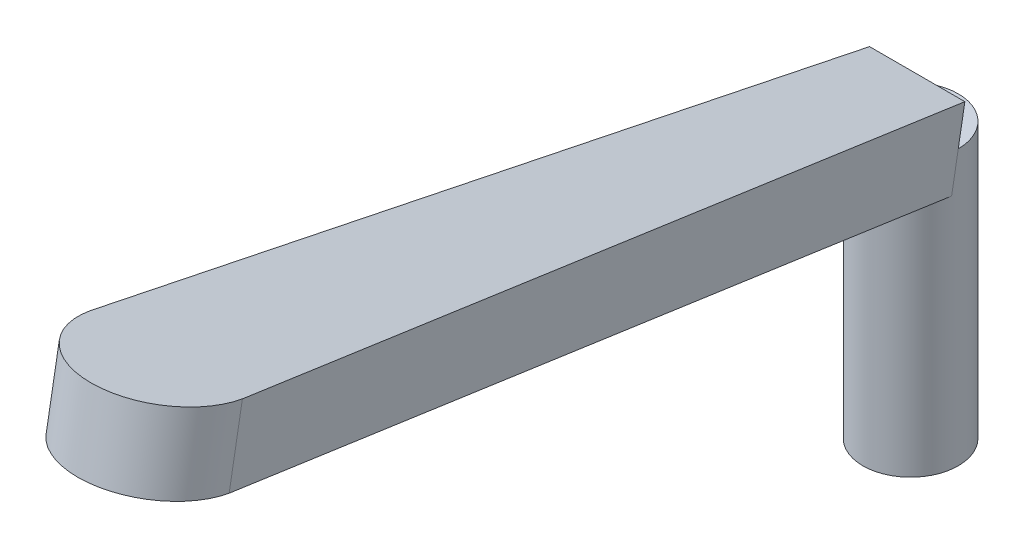
ISO-10303-21;
HEADER;
FILE_DESCRIPTION(('STEP AP214'),'2;1');
FILE_NAME('part.step','',(''),(''),'','','');
FILE_SCHEMA(('AUTOMOTIVE_DESIGN { 1 0 10303 214 1 1 1 1 }'));
ENDSEC;
DATA;
#1=APPLICATION_CONTEXT('core data for automotive mechanical design processes');
#2=APPLICATION_PROTOCOL_DEFINITION('international standard','automotive_design',2000,#1);
#3=PRODUCT_CONTEXT('',#1,'mechanical');
#4=PRODUCT('Part','Part','',(#3));
#5=PRODUCT_RELATED_PRODUCT_CATEGORY('part','',(#4));
#6=PRODUCT_DEFINITION_FORMATION('','',#4);
#7=PRODUCT_DEFINITION_CONTEXT('part definition',#1,'design');
#8=PRODUCT_DEFINITION('design','',#6,#7);
#9=PRODUCT_DEFINITION_SHAPE('','',#8);
#10=(LENGTH_UNIT() NAMED_UNIT(*) SI_UNIT(.MILLI.,.METRE.));
#11=(NAMED_UNIT(*) PLANE_ANGLE_UNIT() SI_UNIT($,.RADIAN.));
#12=(NAMED_UNIT(*) SI_UNIT($,.STERADIAN.) SOLID_ANGLE_UNIT());
#13=UNCERTAINTY_MEASURE_WITH_UNIT(LENGTH_MEASURE(1.E-05),#10,'distance_accuracy_value','');
#14=(GEOMETRIC_REPRESENTATION_CONTEXT(3) GLOBAL_UNCERTAINTY_ASSIGNED_CONTEXT((#13)) GLOBAL_UNIT_ASSIGNED_CONTEXT((#10,
#11,#12)) REPRESENTATION_CONTEXT('',''));
#15=CARTESIAN_POINT('',(0.,0.,0.));
#16=DIRECTION('',(0.,0.,1.));
#17=DIRECTION('',(1.,0.,0.));
#18=AXIS2_PLACEMENT_3D('',#15,#16,#17);
#19=CARTESIAN_POINT('',(0.,45.72,0.));
#20=DIRECTION('',(0.,-1.,0.));
#21=DIRECTION('',(0.,0.,-1.));
#22=AXIS2_PLACEMENT_3D('',#19,#20,#21);
#23=CYLINDRICAL_SURFACE('',#22,7.9375);
#24=CARTESIAN_POINT('',(0.,0.,0.));
#25=DIRECTION('',(0.,1.,0.));
#26=DIRECTION('',(0.,0.,1.));
#27=AXIS2_PLACEMENT_3D('',#24,#25,#26);
#28=CIRCLE('',#27,7.9375);
#29=CARTESIAN_POINT('',(0.,0.,7.9375));
#30=VERTEX_POINT('',#29);
#31=EDGE_CURVE('E122',#30,#30,#28,.T.);
#32=ORIENTED_EDGE('',*,*,#31,.T.);
#33=EDGE_LOOP('',(#32));
#34=FACE_BOUND('',#33,.T.);
#35=CARTESIAN_POINT('',(0.,45.72,0.));
#36=DIRECTION('',(0.,0.173648177666927,0.984807753012209));
#37=DIRECTION('',(0.,-0.984807753012209,0.173648177666927));
#38=AXIS2_PLACEMENT_3D('',#35,#36,#37);
#39=ELLIPSE('',#38,45.7102407099534,7.9375);
#40=CARTESIAN_POINT('',(7.86053650209831,39.4664707683725,1.10266592818499));
#41=VERTEX_POINT('',#40);
#42=CARTESIAN_POINT('',(7.9375,45.72,0.));
#43=VERTEX_POINT('',#42);
#44=EDGE_CURVE('E114',#41,#43,#39,.T.);
#45=ORIENTED_EDGE('',*,*,#44,.F.);
#46=CARTESIAN_POINT('',(0.,39.2720410145255,0.));
#47=DIRECTION('',(0.,0.984807753012209,-0.173648177666927));
#48=DIRECTION('',(0.,-0.173648177666927,-0.984807753012209));
#49=AXIS2_PLACEMENT_3D('',#46,#47,#48);
#50=ELLIPSE('',#49,8.0599487318431,7.9375);
#51=CARTESIAN_POINT('',(-7.86053650209831,39.4664707683725,1.10266592818499));
#52=VERTEX_POINT('',#51);
#53=EDGE_CURVE('E11',#52,#41,#50,.T.);
#54=ORIENTED_EDGE('',*,*,#53,.F.);
#55=CARTESIAN_POINT('',(-7.9375,45.72,0.));
#56=VERTEX_POINT('',#55);
#57=EDGE_CURVE('E94',#56,#52,#39,.T.);
#58=ORIENTED_EDGE('',*,*,#57,.F.);
#59=CARTESIAN_POINT('',(0.,45.72,0.));
#60=DIRECTION('',(0.,1.,0.));
#61=DIRECTION('',(0.,0.,1.));
#62=AXIS2_PLACEMENT_3D('',#59,#60,#61);
#63=CIRCLE('',#62,7.9375);
#64=EDGE_CURVE('E119',#43,#56,#63,.T.);
#65=ORIENTED_EDGE('',*,*,#64,.F.);
#66=EDGE_LOOP('',(#45,#54,#58,#65));
#67=FACE_BOUND('',#66,.T.);
#68=ADVANCED_FACE('F37',(#34,#67),#23,.T.);
#69=CARTESIAN_POINT('',(0.,45.72,0.));
#70=DIRECTION('',(0.,1.,0.));
#71=DIRECTION('',(0.,0.,1.));
#72=AXIS2_PLACEMENT_3D('',#69,#70,#71);
#73=PLANE('',#72);
#74=ORIENTED_EDGE('',*,*,#64,.T.);
#75=DIRECTION('',(1.,0.,0.));
#76=VECTOR('',#75,1.);
#77=CARTESIAN_POINT('',(0.,45.72,0.));
#78=LINE('',#77,#76);
#79=EDGE_CURVE('E44',#56,#43,#78,.T.);
#80=ORIENTED_EDGE('',*,*,#79,.T.);
#81=EDGE_LOOP('',(#74,#80));
#82=FACE_BOUND('',#81,.T.);
#83=ADVANCED_FACE('F126',(#82),#73,.T.);
#84=CARTESIAN_POINT('',(0.,0.,0.));
#85=DIRECTION('',(0.,1.,0.));
#86=DIRECTION('',(0.,0.,1.));
#87=AXIS2_PLACEMENT_3D('',#84,#85,#86);
#88=PLANE('',#87);
#89=ORIENTED_EDGE('',*,*,#31,.F.);
#90=EDGE_LOOP('',(#89));
#91=FACE_BOUND('',#90,.T.);
#92=ADVANCED_FACE('F173',(#91),#88,.F.);
#93=CARTESIAN_POINT('',(-7.9375,39.4664707683725,1.10266592818499));
#94=DIRECTION('',(0.,0.173648177666927,0.984807753012209));
#95=DIRECTION('',(0.,-0.984807753012209,0.173648177666927));
#96=AXIS2_PLACEMENT_3D('',#93,#94,#95);
#97=PLANE('',#96);
#98=DIRECTION('',(1.,0.,0.));
#99=VECTOR('',#98,1.);
#100=CARTESIAN_POINT('',(-7.9375,39.4664707683725,1.10266592818499));
#101=LINE('',#100,#99);
#102=CARTESIAN_POINT('',(7.9375,39.4664707683725,1.10266592818499));
#103=VERTEX_POINT('',#102);
#104=EDGE_CURVE('E98',#41,#103,#101,.T.);
#105=ORIENTED_EDGE('',*,*,#104,.F.);
#106=ORIENTED_EDGE('',*,*,#44,.T.);
#107=DIRECTION('',(0.,0.984807753012209,-0.173648177666927));
#108=VECTOR('',#107,1.);
#109=CARTESIAN_POINT('',(7.9375,39.4664707683725,1.10266592818499));
#110=LINE('',#109,#108);
#111=EDGE_CURVE('E51',#103,#43,#110,.T.);
#112=ORIENTED_EDGE('',*,*,#111,.F.);
#113=EDGE_LOOP('',(#105,#106,#112));
#114=FACE_BOUND('',#113,.T.);
#115=ADVANCED_FACE('F132',(#114),#97,.F.);
#116=DIRECTION('',(0.,0.984807753012209,-0.173648177666927));
#117=VECTOR('',#116,1.);
#118=CARTESIAN_POINT('',(-7.9375,39.4664707683725,1.10266592818499));
#119=LINE('',#118,#117);
#120=CARTESIAN_POINT('',(-7.9375,39.4664707683725,1.10266592818499));
#121=VERTEX_POINT('',#120);
#122=EDGE_CURVE('E92',#121,#56,#119,.T.);
#123=ORIENTED_EDGE('',*,*,#122,.T.);
#124=ORIENTED_EDGE('',*,*,#57,.T.);
#125=EDGE_CURVE('E88',#121,#52,#101,.T.);
#126=ORIENTED_EDGE('',*,*,#125,.F.);
#127=EDGE_LOOP('',(#123,#124,#126));
#128=FACE_BOUND('',#127,.T.);
#129=ADVANCED_FACE('F90',(#128),#97,.F.);
#130=CARTESIAN_POINT('',(-12.6999999999999,61.5197893320722,126.173250560735));
#131=DIRECTION('',(0.999297615709181,0.00650723287180506,0.0369043514818875));
#132=DIRECTION('',(0.0369051328471014,0.,-0.999318773550031));
#133=AXIS2_PLACEMENT_3D('',#130,#131,#132);
#134=PLANE('',#133);
#135=DIRECTION('',(0.0374736605890936,-0.173526209914805,-0.984116039517016));
#136=VECTOR('',#135,1.);
#137=CARTESIAN_POINT('',(-12.6999999999999,74.0268477953273,123.967918704366));
#138=LINE('',#137,#136);
#139=CARTESIAN_POINT('',(-12.6999999999999,74.0268477953273,123.967918704366));
#140=VERTEX_POINT('',#139);
#141=CARTESIAN_POINT('',(-7.9375,51.9735292316275,-1.10266592818499));
#142=VERTEX_POINT('',#141);
#143=EDGE_CURVE('E137',#140,#142,#138,.T.);
#144=ORIENTED_EDGE('',*,*,#143,.T.);
#145=EDGE_CURVE('E112',#56,#142,#119,.T.);
#146=ORIENTED_EDGE('',*,*,#145,.F.);
#147=ORIENTED_EDGE('',*,*,#122,.F.);
#148=DIRECTION('',(0.0374736605890936,-0.173526209914805,-0.984116039517016));
#149=VECTOR('',#148,1.);
#150=CARTESIAN_POINT('',(-12.6999999999999,61.5197893320722,126.173250560735));
#151=LINE('',#150,#149);
#152=CARTESIAN_POINT('',(-12.6999999999999,61.5197893320722,126.173250560735));
#153=VERTEX_POINT('',#152);
#154=EDGE_CURVE('E101',#153,#121,#151,.T.);
#155=ORIENTED_EDGE('',*,*,#154,.F.);
#156=DIRECTION('',(0.,0.984807753012209,-0.173648177666927));
#157=VECTOR('',#156,1.);
#158=CARTESIAN_POINT('',(-12.6999999999999,61.5197893320722,126.173250560735));
#159=LINE('',#158,#157);
#160=EDGE_CURVE('E136',#153,#140,#159,.T.);
#161=ORIENTED_EDGE('',*,*,#160,.T.);
#162=EDGE_LOOP('',(#144,#146,#147,#155,#161));
#163=FACE_BOUND('',#162,.T.);
#164=ADVANCED_FACE('F111',(#163),#134,.F.);
#165=ORIENTED_EDGE('',*,*,#79,.F.);
#166=ORIENTED_EDGE('',*,*,#145,.T.);
#167=DIRECTION('',(1.,0.,0.));
#168=VECTOR('',#167,1.);
#169=CARTESIAN_POINT('',(-7.9375,51.9735292316275,-1.10266592818499));
#170=LINE('',#169,#168);
#171=CARTESIAN_POINT('',(7.9375,51.9735292316275,-1.10266592818499));
#172=VERTEX_POINT('',#171);
#173=EDGE_CURVE('E139',#142,#172,#170,.T.);
#174=ORIENTED_EDGE('',*,*,#173,.T.);
#175=EDGE_CURVE('E147',#43,#172,#110,.T.);
#176=ORIENTED_EDGE('',*,*,#175,.F.);
#177=EDGE_LOOP('',(#165,#166,#174,#176));
#178=FACE_BOUND('',#177,.T.);
#179=ADVANCED_FACE('F154',(#178),#97,.F.);
#180=CARTESIAN_POINT('',(7.9375,39.4664707683725,1.10266592818499));
#181=DIRECTION('',(-0.999297615709181,0.00650723287180529,0.0369043514818887));
#182=DIRECTION('',(0.0369051328471027,0.,0.999318773550031));
#183=AXIS2_PLACEMENT_3D('',#180,#181,#182);
#184=PLANE('',#183);
#185=DIRECTION('',(0.0374736605890949,0.173526209914805,0.984116039517016));
#186=VECTOR('',#185,1.);
#187=CARTESIAN_POINT('',(7.9375,51.9735292316275,-1.10266592818499));
#188=LINE('',#187,#186);
#189=CARTESIAN_POINT('',(12.7000000000001,74.0268477953273,123.967918704366));
#190=VERTEX_POINT('',#189);
#191=EDGE_CURVE('E142',#172,#190,#188,.T.);
#192=ORIENTED_EDGE('',*,*,#191,.T.);
#193=DIRECTION('',(0.,0.984807753012209,-0.173648177666927));
#194=VECTOR('',#193,1.);
#195=CARTESIAN_POINT('',(12.7000000000001,61.5197893320722,126.173250560735));
#196=LINE('',#195,#194);
#197=CARTESIAN_POINT('',(12.7000000000001,61.5197893320722,126.173250560735));
#198=VERTEX_POINT('',#197);
#199=EDGE_CURVE('E145',#198,#190,#196,.T.);
#200=ORIENTED_EDGE('',*,*,#199,.F.);
#201=DIRECTION('',(0.0374736605890949,0.173526209914805,0.984116039517016));
#202=VECTOR('',#201,1.);
#203=CARTESIAN_POINT('',(7.9375,39.4664707683725,1.10266592818499));
#204=LINE('',#203,#202);
#205=EDGE_CURVE('E97',#103,#198,#204,.T.);
#206=ORIENTED_EDGE('',*,*,#205,.F.);
#207=ORIENTED_EDGE('',*,*,#111,.T.);
#208=ORIENTED_EDGE('',*,*,#175,.T.);
#209=EDGE_LOOP('',(#192,#200,#206,#207,#208));
#210=FACE_BOUND('',#209,.T.);
#211=ADVANCED_FACE('F151',(#210),#184,.F.);
#212=CARTESIAN_POINT('',(0.,61.5197893320722,126.173250560735));
#213=DIRECTION('',(0.,0.984807753012209,-0.173648177666927));
#214=DIRECTION('',(0.,0.173648177666927,0.984807753012209));
#215=AXIS2_PLACEMENT_3D('',#212,#213,#214);
#216=CYLINDRICAL_SURFACE('',#215,12.7);
#217=CARTESIAN_POINT('',(0.,74.0268477953273,123.967918704366));
#218=DIRECTION('',(0.,-0.984807753012209,0.173648177666927));
#219=DIRECTION('',(0.,0.173648177666927,0.984807753012209));
#220=AXIS2_PLACEMENT_3D('',#217,#218,#219);
#221=CIRCLE('',#220,12.7);
#222=EDGE_CURVE('E108',#190,#140,#221,.T.);
#223=ORIENTED_EDGE('',*,*,#222,.T.);
#224=ORIENTED_EDGE('',*,*,#160,.F.);
#225=CARTESIAN_POINT('',(0.,61.5197893320722,126.173250560735));
#226=DIRECTION('',(0.,-0.984807753012209,0.173648177666927));
#227=DIRECTION('',(0.,0.173648177666927,0.984807753012209));
#228=AXIS2_PLACEMENT_3D('',#225,#226,#227);
#229=CIRCLE('',#228,12.7);
#230=EDGE_CURVE('E104',#198,#153,#229,.T.);
#231=ORIENTED_EDGE('',*,*,#230,.F.);
#232=ORIENTED_EDGE('',*,*,#199,.T.);
#233=EDGE_LOOP('',(#223,#224,#231,#232));
#234=FACE_BOUND('',#233,.T.);
#235=ADVANCED_FACE('F158',(#234),#216,.T.);
#236=CARTESIAN_POINT('',(0.,61.5197893320722,126.173250560735));
#237=DIRECTION('',(0.,0.984807753012209,-0.173648177666927));
#238=DIRECTION('',(0.,0.173648177666927,0.984807753012209));
#239=AXIS2_PLACEMENT_3D('',#236,#237,#238);
#240=PLANE('',#239);
#241=ORIENTED_EDGE('',*,*,#125,.T.);
#242=ORIENTED_EDGE('',*,*,#53,.T.);
#243=ORIENTED_EDGE('',*,*,#104,.T.);
#244=ORIENTED_EDGE('',*,*,#205,.T.);
#245=ORIENTED_EDGE('',*,*,#230,.T.);
#246=ORIENTED_EDGE('',*,*,#154,.T.);
#247=EDGE_LOOP('',(#241,#242,#243,#244,#245,#246));
#248=FACE_BOUND('',#247,.T.);
#249=ADVANCED_FACE('F102',(#248),#240,.F.);
#250=CARTESIAN_POINT('',(0.,74.0268477953273,123.967918704366));
#251=DIRECTION('',(0.,0.984807753012209,-0.173648177666927));
#252=DIRECTION('',(0.,0.173648177666927,0.984807753012209));
#253=AXIS2_PLACEMENT_3D('',#250,#251,#252);
#254=PLANE('',#253);
#255=ORIENTED_EDGE('',*,*,#143,.F.);
#256=ORIENTED_EDGE('',*,*,#222,.F.);
#257=ORIENTED_EDGE('',*,*,#191,.F.);
#258=ORIENTED_EDGE('',*,*,#173,.F.);
#259=EDGE_LOOP('',(#255,#256,#257,#258));
#260=FACE_BOUND('',#259,.T.);
#261=ADVANCED_FACE('F157',(#260),#254,.T.);
#262=CLOSED_SHELL('',(#68,#83,#92,#115,#129,#164,#179,#211,#235,#249,#261));
#263=MANIFOLD_SOLID_BREP('B2',#262);
#264=ADVANCED_BREP_SHAPE_REPRESENTATION('',(#18,#263),#14);
#265=SHAPE_DEFINITION_REPRESENTATION(#9,#264);
ENDSEC;
END-ISO-10303-21;
